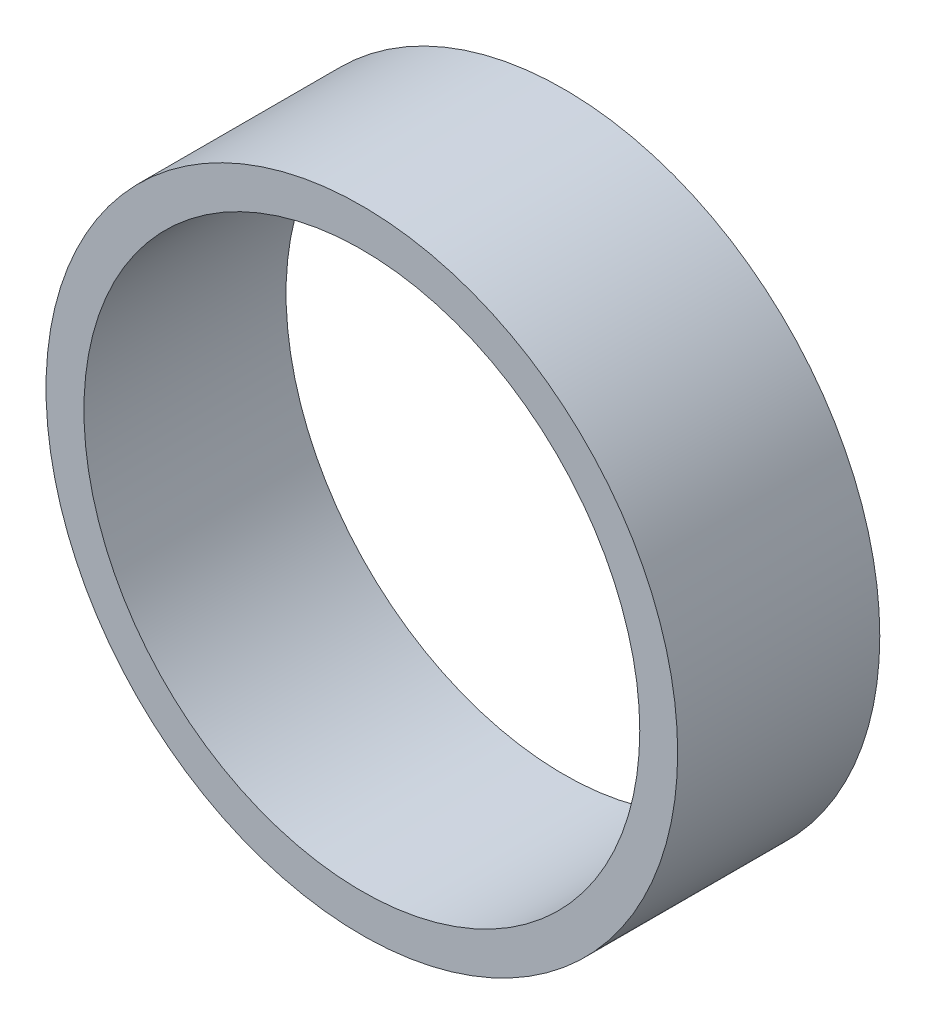
ISO-10303-21;
HEADER;
FILE_DESCRIPTION(('STEP AP214'),'2;1');
FILE_NAME('part.step','',(''),(''),'','','');
FILE_SCHEMA(('AUTOMOTIVE_DESIGN { 1 0 10303 214 1 1 1 1 }'));
ENDSEC;
DATA;
#1=APPLICATION_CONTEXT('core data for automotive mechanical design processes');
#2=APPLICATION_PROTOCOL_DEFINITION('international standard','automotive_design',2000,#1);
#3=PRODUCT_CONTEXT('',#1,'mechanical');
#4=PRODUCT('Part','Part','',(#3));
#5=PRODUCT_RELATED_PRODUCT_CATEGORY('part','',(#4));
#6=PRODUCT_DEFINITION_FORMATION('','',#4);
#7=PRODUCT_DEFINITION_CONTEXT('part definition',#1,'design');
#8=PRODUCT_DEFINITION('design','',#6,#7);
#9=PRODUCT_DEFINITION_SHAPE('','',#8);
#10=(LENGTH_UNIT() NAMED_UNIT(*) SI_UNIT(.MILLI.,.METRE.));
#11=(NAMED_UNIT(*) PLANE_ANGLE_UNIT() SI_UNIT($,.RADIAN.));
#12=(NAMED_UNIT(*) SI_UNIT($,.STERADIAN.) SOLID_ANGLE_UNIT());
#13=UNCERTAINTY_MEASURE_WITH_UNIT(LENGTH_MEASURE(1.E-05),#10,'distance_accuracy_value','');
#14=(GEOMETRIC_REPRESENTATION_CONTEXT(3) GLOBAL_UNCERTAINTY_ASSIGNED_CONTEXT((#13)) GLOBAL_UNIT_ASSIGNED_CONTEXT((#10,
#11,#12)) REPRESENTATION_CONTEXT('',''));
#15=CARTESIAN_POINT('',(0.,0.,0.));
#16=DIRECTION('',(0.,0.,1.));
#17=DIRECTION('',(1.,0.,0.));
#18=AXIS2_PLACEMENT_3D('',#15,#16,#17);
#19=CARTESIAN_POINT('',(0.,0.,20.));
#20=DIRECTION('',(0.,0.,1.));
#21=DIRECTION('',(1.,0.,0.));
#22=AXIS2_PLACEMENT_3D('',#19,#20,#21);
#23=PLANE('',#22);
#24=CARTESIAN_POINT('',(0.,0.,20.));
#25=DIRECTION('',(0.,0.,1.));
#26=DIRECTION('',(1.,0.,0.));
#27=AXIS2_PLACEMENT_3D('',#24,#25,#26);
#28=CIRCLE('',#27,62.5);
#29=CARTESIAN_POINT('',(62.5,0.,20.));
#30=VERTEX_POINT('',#29);
#31=EDGE_CURVE('E10',#30,#30,#28,.T.);
#32=ORIENTED_EDGE('',*,*,#31,.T.);
#33=EDGE_LOOP('',(#32));
#34=FACE_BOUND('',#33,.T.);
#35=CARTESIAN_POINT('',(0.,0.,20.));
#36=DIRECTION('',(0.,0.,1.));
#37=DIRECTION('',(1.,0.,0.));
#38=AXIS2_PLACEMENT_3D('',#35,#36,#37);
#39=CIRCLE('',#38,55.);
#40=CARTESIAN_POINT('',(55.,0.,20.));
#41=VERTEX_POINT('',#40);
#42=EDGE_CURVE('E45',#41,#41,#39,.T.);
#43=ORIENTED_EDGE('',*,*,#42,.F.);
#44=EDGE_LOOP('',(#43));
#45=FACE_BOUND('',#44,.T.);
#46=ADVANCED_FACE('F34',(#34,#45),#23,.T.);
#47=CARTESIAN_POINT('',(0.,0.,-20.));
#48=DIRECTION('',(0.,0.,1.));
#49=DIRECTION('',(1.,0.,0.));
#50=AXIS2_PLACEMENT_3D('',#47,#48,#49);
#51=PLANE('',#50);
#52=CARTESIAN_POINT('',(0.,0.,-20.));
#53=DIRECTION('',(0.,0.,1.));
#54=DIRECTION('',(1.,0.,0.));
#55=AXIS2_PLACEMENT_3D('',#52,#53,#54);
#56=CIRCLE('',#55,62.5);
#57=CARTESIAN_POINT('',(62.5,0.,-20.));
#58=VERTEX_POINT('',#57);
#59=EDGE_CURVE('E38',#58,#58,#56,.T.);
#60=ORIENTED_EDGE('',*,*,#59,.F.);
#61=EDGE_LOOP('',(#60));
#62=FACE_BOUND('',#61,.T.);
#63=CARTESIAN_POINT('',(0.,0.,-20.));
#64=DIRECTION('',(0.,0.,1.));
#65=DIRECTION('',(1.,0.,0.));
#66=AXIS2_PLACEMENT_3D('',#63,#64,#65);
#67=CIRCLE('',#66,55.);
#68=CARTESIAN_POINT('',(55.,0.,-20.));
#69=VERTEX_POINT('',#68);
#70=EDGE_CURVE('E47',#69,#69,#67,.T.);
#71=ORIENTED_EDGE('',*,*,#70,.T.);
#72=EDGE_LOOP('',(#71));
#73=FACE_BOUND('',#72,.T.);
#74=ADVANCED_FACE('F57',(#62,#73),#51,.F.);
#75=CARTESIAN_POINT('',(0.,0.,20.));
#76=DIRECTION('',(0.,0.,-1.));
#77=DIRECTION('',(-1.,0.,0.));
#78=AXIS2_PLACEMENT_3D('',#75,#76,#77);
#79=CYLINDRICAL_SURFACE('',#78,62.5);
#80=ORIENTED_EDGE('',*,*,#31,.F.);
#81=EDGE_LOOP('',(#80));
#82=FACE_BOUND('',#81,.T.);
#83=ORIENTED_EDGE('',*,*,#59,.T.);
#84=EDGE_LOOP('',(#83));
#85=FACE_BOUND('',#84,.T.);
#86=ADVANCED_FACE('F36',(#82,#85),#79,.T.);
#87=CARTESIAN_POINT('',(0.,0.,20.));
#88=DIRECTION('',(0.,0.,-1.));
#89=DIRECTION('',(-1.,0.,0.));
#90=AXIS2_PLACEMENT_3D('',#87,#88,#89);
#91=CYLINDRICAL_SURFACE('',#90,55.);
#92=ORIENTED_EDGE('',*,*,#42,.T.);
#93=EDGE_LOOP('',(#92));
#94=FACE_BOUND('',#93,.T.);
#95=ORIENTED_EDGE('',*,*,#70,.F.);
#96=EDGE_LOOP('',(#95));
#97=FACE_BOUND('',#96,.T.);
#98=ADVANCED_FACE('F53',(#94,#97),#91,.F.);
#99=CLOSED_SHELL('',(#46,#74,#86,#98));
#100=MANIFOLD_SOLID_BREP('B2',#99);
#101=ADVANCED_BREP_SHAPE_REPRESENTATION('',(#18,#100),#14);
#102=SHAPE_DEFINITION_REPRESENTATION(#9,#101);
ENDSEC;
END-ISO-10303-21;
